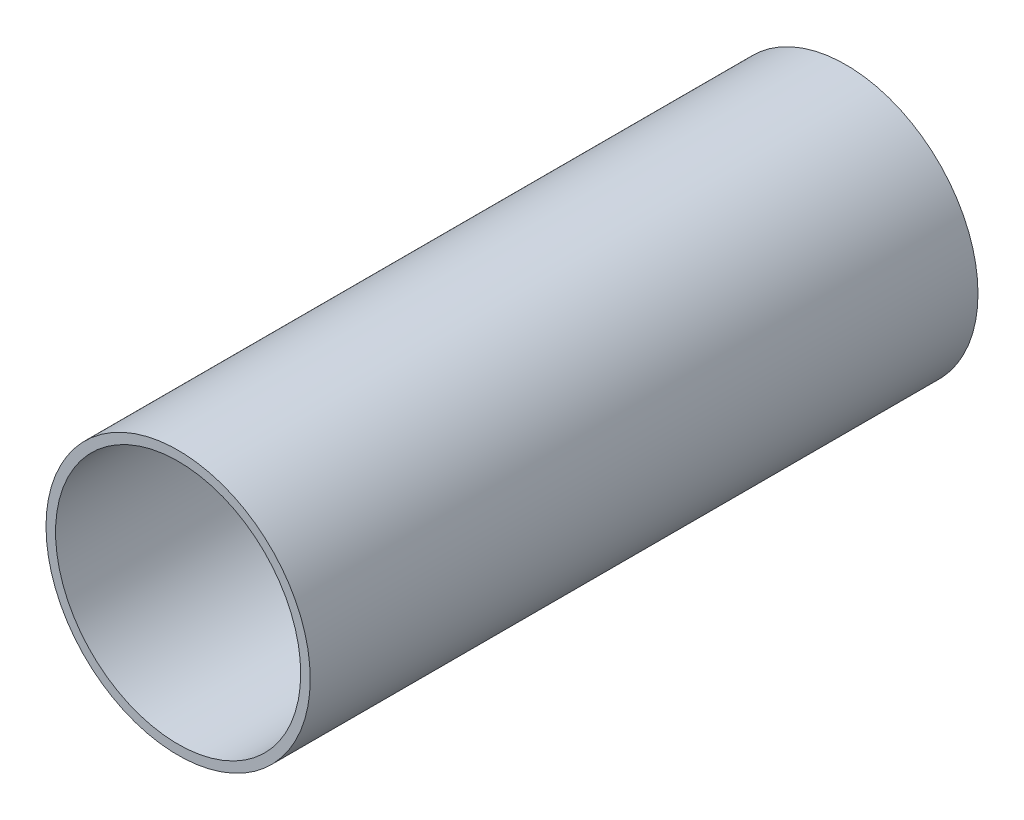
ISO-10303-21;
HEADER;
FILE_DESCRIPTION(('STEP AP214'),'2;1');
FILE_NAME('part.step','',(''),(''),'','','');
FILE_SCHEMA(('AUTOMOTIVE_DESIGN { 1 0 10303 214 1 1 1 1 }'));
ENDSEC;
DATA;
#1=APPLICATION_CONTEXT('core data for automotive mechanical design processes');
#2=APPLICATION_PROTOCOL_DEFINITION('international standard','automotive_design',2000,#1);
#3=PRODUCT_CONTEXT('',#1,'mechanical');
#4=PRODUCT('Part','Part','',(#3));
#5=PRODUCT_RELATED_PRODUCT_CATEGORY('part','',(#4));
#6=PRODUCT_DEFINITION_FORMATION('','',#4);
#7=PRODUCT_DEFINITION_CONTEXT('part definition',#1,'design');
#8=PRODUCT_DEFINITION('design','',#6,#7);
#9=PRODUCT_DEFINITION_SHAPE('','',#8);
#10=(LENGTH_UNIT() NAMED_UNIT(*) SI_UNIT(.MILLI.,.METRE.));
#11=(NAMED_UNIT(*) PLANE_ANGLE_UNIT() SI_UNIT($,.RADIAN.));
#12=(NAMED_UNIT(*) SI_UNIT($,.STERADIAN.) SOLID_ANGLE_UNIT());
#13=UNCERTAINTY_MEASURE_WITH_UNIT(LENGTH_MEASURE(1.E-05),#10,'distance_accuracy_value','');
#14=(GEOMETRIC_REPRESENTATION_CONTEXT(3) GLOBAL_UNCERTAINTY_ASSIGNED_CONTEXT((#13)) GLOBAL_UNIT_ASSIGNED_CONTEXT((#10,
#11,#12)) REPRESENTATION_CONTEXT('',''));
#15=CARTESIAN_POINT('',(0.,0.,0.));
#16=DIRECTION('',(0.,0.,1.));
#17=DIRECTION('',(1.,0.,0.));
#18=AXIS2_PLACEMENT_3D('',#15,#16,#17);
#19=CARTESIAN_POINT('',(27.7,0.,0.));
#20=DIRECTION('',(0.,0.,1.));
#21=DIRECTION('',(1.,0.,0.));
#22=AXIS2_PLACEMENT_3D('',#19,#20,#21);
#23=PLANE('',#22);
#24=CARTESIAN_POINT('',(0.,0.,0.));
#25=DIRECTION('',(0.,0.,1.));
#26=DIRECTION('',(1.,0.,0.));
#27=AXIS2_PLACEMENT_3D('',#24,#25,#26);
#28=CIRCLE('',#27,27.7);
#29=CARTESIAN_POINT('',(27.7,0.,0.));
#30=VERTEX_POINT('',#29);
#31=EDGE_CURVE('E50',#30,#30,#28,.T.);
#32=ORIENTED_EDGE('',*,*,#31,.T.);
#33=EDGE_LOOP('',(#32));
#34=FACE_BOUND('',#33,.T.);
#35=CARTESIAN_POINT('',(0.,0.,0.));
#36=DIRECTION('',(0.,0.,1.));
#37=DIRECTION('',(1.,0.,0.));
#38=AXIS2_PLACEMENT_3D('',#35,#36,#37);
#39=CIRCLE('',#38,25.7);
#40=CARTESIAN_POINT('',(25.7,0.,0.));
#41=VERTEX_POINT('',#40);
#42=EDGE_CURVE('E10',#41,#41,#39,.T.);
#43=ORIENTED_EDGE('',*,*,#42,.F.);
#44=EDGE_LOOP('',(#43));
#45=FACE_BOUND('',#44,.T.);
#46=ADVANCED_FACE('F36',(#34,#45),#23,.T.);
#47=CARTESIAN_POINT('',(0.,0.,0.));
#48=DIRECTION('',(0.,0.,1.));
#49=DIRECTION('',(1.,0.,0.));
#50=AXIS2_PLACEMENT_3D('',#47,#48,#49);
#51=CYLINDRICAL_SURFACE('',#50,25.7);
#52=ORIENTED_EDGE('',*,*,#42,.T.);
#53=EDGE_LOOP('',(#52));
#54=FACE_BOUND('',#53,.T.);
#55=CARTESIAN_POINT('',(0.,0.,-140.));
#56=DIRECTION('',(0.,0.,1.));
#57=DIRECTION('',(1.,0.,0.));
#58=AXIS2_PLACEMENT_3D('',#55,#56,#57);
#59=CIRCLE('',#58,25.7);
#60=CARTESIAN_POINT('',(25.7,0.,-140.));
#61=VERTEX_POINT('',#60);
#62=EDGE_CURVE('E42',#61,#61,#59,.T.);
#63=ORIENTED_EDGE('',*,*,#62,.F.);
#64=EDGE_LOOP('',(#63));
#65=FACE_BOUND('',#64,.T.);
#66=ADVANCED_FACE('F66',(#54,#65),#51,.F.);
#67=CARTESIAN_POINT('',(25.7,0.,-140.));
#68=DIRECTION('',(0.,0.,-1.));
#69=DIRECTION('',(-1.,0.,0.));
#70=AXIS2_PLACEMENT_3D('',#67,#68,#69);
#71=PLANE('',#70);
#72=ORIENTED_EDGE('',*,*,#62,.T.);
#73=EDGE_LOOP('',(#72));
#74=FACE_BOUND('',#73,.T.);
#75=CARTESIAN_POINT('',(0.,0.,-140.));
#76=DIRECTION('',(0.,0.,1.));
#77=DIRECTION('',(1.,0.,0.));
#78=AXIS2_PLACEMENT_3D('',#75,#76,#77);
#79=CIRCLE('',#78,27.7);
#80=CARTESIAN_POINT('',(27.7,0.,-140.));
#81=VERTEX_POINT('',#80);
#82=EDGE_CURVE('E46',#81,#81,#79,.T.);
#83=ORIENTED_EDGE('',*,*,#82,.F.);
#84=EDGE_LOOP('',(#83));
#85=FACE_BOUND('',#84,.T.);
#86=ADVANCED_FACE('F60',(#74,#85),#71,.T.);
#87=CARTESIAN_POINT('',(0.,0.,0.));
#88=DIRECTION('',(0.,0.,1.));
#89=DIRECTION('',(1.,0.,0.));
#90=AXIS2_PLACEMENT_3D('',#87,#88,#89);
#91=CYLINDRICAL_SURFACE('',#90,27.7);
#92=ORIENTED_EDGE('',*,*,#82,.T.);
#93=EDGE_LOOP('',(#92));
#94=FACE_BOUND('',#93,.T.);
#95=ORIENTED_EDGE('',*,*,#31,.F.);
#96=EDGE_LOOP('',(#95));
#97=FACE_BOUND('',#96,.T.);
#98=ADVANCED_FACE('F58',(#94,#97),#91,.T.);
#99=CLOSED_SHELL('',(#46,#66,#86,#98));
#100=MANIFOLD_SOLID_BREP('B2',#99);
#101=ADVANCED_BREP_SHAPE_REPRESENTATION('',(#18,#100),#14);
#102=SHAPE_DEFINITION_REPRESENTATION(#9,#101);
ENDSEC;
END-ISO-10303-21;
